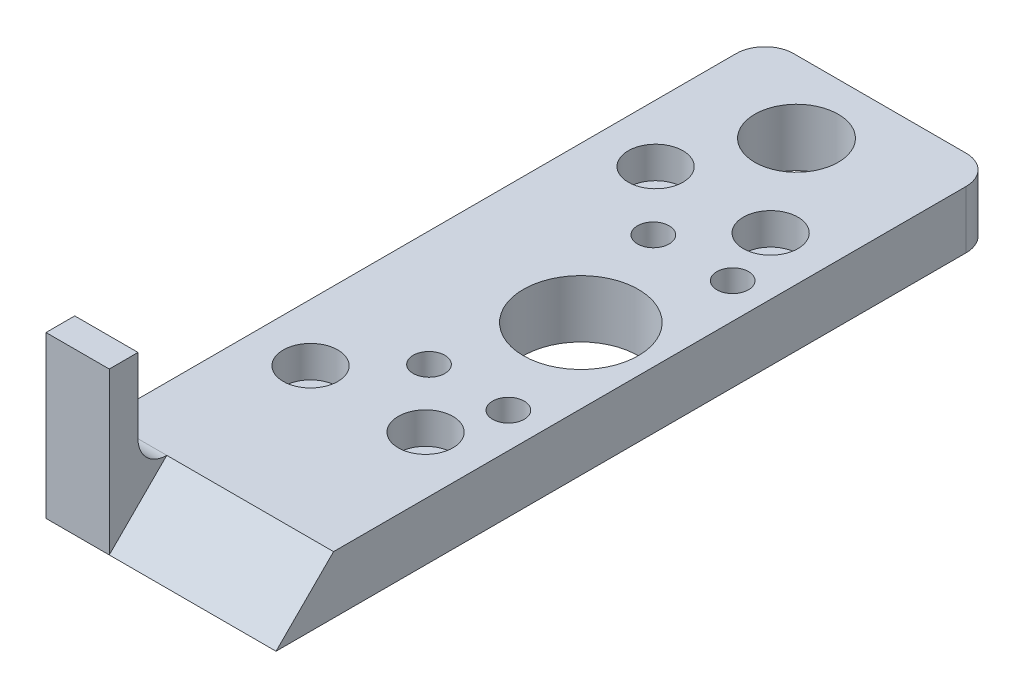
ISO-10303-21;
HEADER;
FILE_DESCRIPTION(('STEP AP214'),'2;1');
FILE_NAME('part.step','',(''),(''),'','','');
FILE_SCHEMA(('AUTOMOTIVE_DESIGN { 1 0 10303 214 1 1 1 1 }'));
ENDSEC;
DATA;
#1=APPLICATION_CONTEXT('core data for automotive mechanical design processes');
#2=APPLICATION_PROTOCOL_DEFINITION('international standard','automotive_design',2000,#1);
#3=PRODUCT_CONTEXT('',#1,'mechanical');
#4=PRODUCT('Part','Part','',(#3));
#5=PRODUCT_RELATED_PRODUCT_CATEGORY('part','',(#4));
#6=PRODUCT_DEFINITION_FORMATION('','',#4);
#7=PRODUCT_DEFINITION_CONTEXT('part definition',#1,'design');
#8=PRODUCT_DEFINITION('design','',#6,#7);
#9=PRODUCT_DEFINITION_SHAPE('','',#8);
#10=(LENGTH_UNIT() NAMED_UNIT(*) SI_UNIT(.MILLI.,.METRE.));
#11=(NAMED_UNIT(*) PLANE_ANGLE_UNIT() SI_UNIT($,.RADIAN.));
#12=(NAMED_UNIT(*) SI_UNIT($,.STERADIAN.) SOLID_ANGLE_UNIT());
#13=UNCERTAINTY_MEASURE_WITH_UNIT(LENGTH_MEASURE(1.E-05),#10,'distance_accuracy_value','');
#14=(GEOMETRIC_REPRESENTATION_CONTEXT(3) GLOBAL_UNCERTAINTY_ASSIGNED_CONTEXT((#13)) GLOBAL_UNIT_ASSIGNED_CONTEXT((#10,
#11,#12)) REPRESENTATION_CONTEXT('',''));
#15=CARTESIAN_POINT('',(0.,0.,0.));
#16=DIRECTION('',(0.,0.,1.));
#17=DIRECTION('',(1.,0.,0.));
#18=AXIS2_PLACEMENT_3D('',#15,#16,#17);
#19=CARTESIAN_POINT('',(20.,28.,-5.));
#20=DIRECTION('',(0.,-1.,0.));
#21=DIRECTION('',(0.,0.,-1.));
#22=AXIS2_PLACEMENT_3D('',#19,#20,#21);
#23=PLANE('',#22);
#24=DIRECTION('',(-1.,0.,0.));
#25=VECTOR('',#24,1.);
#26=CARTESIAN_POINT('',(20.,28.,0.));
#27=LINE('',#26,#25);
#28=CARTESIAN_POINT('',(-9.,28.,0.));
#29=VERTEX_POINT('',#28);
#30=CARTESIAN_POINT('',(-20.,28.,0.));
#31=VERTEX_POINT('',#30);
#32=EDGE_CURVE('E128',#29,#31,#27,.T.);
#33=ORIENTED_EDGE('',*,*,#32,.F.);
#34=DIRECTION('',(0.,0.,1.));
#35=VECTOR('',#34,1.);
#36=CARTESIAN_POINT('',(-9.,28.,-5.));
#37=LINE('',#36,#35);
#38=CARTESIAN_POINT('',(-9.,28.,-5.));
#39=VERTEX_POINT('',#38);
#40=EDGE_CURVE('E112',#39,#29,#37,.T.);
#41=ORIENTED_EDGE('',*,*,#40,.F.);
#42=DIRECTION('',(-1.,0.,0.));
#43=VECTOR('',#42,1.);
#44=CARTESIAN_POINT('',(20.,28.,-5.));
#45=LINE('',#44,#43);
#46=CARTESIAN_POINT('',(-20.,28.,-5.));
#47=VERTEX_POINT('',#46);
#48=EDGE_CURVE('E237',#39,#47,#45,.T.);
#49=ORIENTED_EDGE('',*,*,#48,.T.);
#50=DIRECTION('',(0.,0.,1.));
#51=VECTOR('',#50,1.);
#52=CARTESIAN_POINT('',(-20.,28.,-5.));
#53=LINE('',#52,#51);
#54=EDGE_CURVE('E132',#47,#31,#53,.T.);
#55=ORIENTED_EDGE('',*,*,#54,.T.);
#56=EDGE_LOOP('',(#33,#41,#49,#55));
#57=FACE_BOUND('',#56,.T.);
#58=ADVANCED_FACE('F32',(#57),#23,.F.);
#59=CARTESIAN_POINT('',(20.,28.,0.));
#60=DIRECTION('',(0.,0.,-1.));
#61=DIRECTION('',(0.,1.,0.));
#62=AXIS2_PLACEMENT_3D('',#59,#60,#61);
#63=PLANE('',#62);
#64=DIRECTION('',(-1.,0.,0.));
#65=VECTOR('',#64,1.);
#66=CARTESIAN_POINT('',(20.,0.,0.));
#67=LINE('',#66,#65);
#68=CARTESIAN_POINT('',(-9.,0.,0.));
#69=VERTEX_POINT('',#68);
#70=CARTESIAN_POINT('',(-20.,0.,0.));
#71=VERTEX_POINT('',#70);
#72=EDGE_CURVE('E130',#69,#71,#67,.T.);
#73=ORIENTED_EDGE('',*,*,#72,.F.);
#74=DIRECTION('',(0.,1.,0.));
#75=VECTOR('',#74,1.);
#76=CARTESIAN_POINT('',(-9.,-19.4278779391243,0.));
#77=LINE('',#76,#75);
#78=EDGE_CURVE('E115',#69,#29,#77,.T.);
#79=ORIENTED_EDGE('',*,*,#78,.T.);
#80=ORIENTED_EDGE('',*,*,#32,.T.);
#81=DIRECTION('',(0.,-1.,0.));
#82=VECTOR('',#81,1.);
#83=CARTESIAN_POINT('',(-20.,28.,0.));
#84=LINE('',#83,#82);
#85=EDGE_CURVE('E233',#31,#71,#84,.T.);
#86=ORIENTED_EDGE('',*,*,#85,.T.);
#87=EDGE_LOOP('',(#73,#79,#80,#86));
#88=FACE_BOUND('',#87,.T.);
#89=ADVANCED_FACE('F126',(#88),#63,.F.);
#90=CARTESIAN_POINT('',(20.,0.,0.));
#91=DIRECTION('',(0.,1.,0.));
#92=DIRECTION('',(0.,0.,1.));
#93=AXIS2_PLACEMENT_3D('',#90,#91,#92);
#94=PLANE('',#93);
#95=CARTESIAN_POINT('',(-2.,0.,-112.5));
#96=DIRECTION('',(0.,1.,0.));
#97=DIRECTION('',(0.,0.,1.));
#98=AXIS2_PLACEMENT_3D('',#95,#96,#97);
#99=CIRCLE('',#98,7.25);
#100=CARTESIAN_POINT('',(-2.,0.,-105.25));
#101=VERTEX_POINT('',#100);
#102=EDGE_CURVE('E313',#101,#101,#99,.T.);
#103=ORIENTED_EDGE('',*,*,#102,.T.);
#104=EDGE_LOOP('',(#103));
#105=FACE_BOUND('',#104,.T.);
#106=CARTESIAN_POINT('',(10.,0.,-96.));
#107=DIRECTION('',(0.,1.,0.));
#108=DIRECTION('',(0.,0.,1.));
#109=AXIS2_PLACEMENT_3D('',#106,#107,#108);
#110=CIRCLE('',#109,2.75000000000001);
#111=CARTESIAN_POINT('',(10.,0.,-93.25));
#112=VERTEX_POINT('',#111);
#113=EDGE_CURVE('E195',#112,#112,#110,.T.);
#114=ORIENTED_EDGE('',*,*,#113,.T.);
#115=EDGE_LOOP('',(#114));
#116=FACE_BOUND('',#115,.T.);
#117=CARTESIAN_POINT('',(-10.,0.,-96.));
#118=DIRECTION('',(0.,1.,0.));
#119=DIRECTION('',(0.,0.,1.));
#120=AXIS2_PLACEMENT_3D('',#117,#118,#119);
#121=CIRCLE('',#120,2.75000000000001);
#122=CARTESIAN_POINT('',(-10.,0.,-93.25));
#123=VERTEX_POINT('',#122);
#124=EDGE_CURVE('E190',#123,#123,#121,.T.);
#125=ORIENTED_EDGE('',*,*,#124,.T.);
#126=EDGE_LOOP('',(#125));
#127=FACE_BOUND('',#126,.T.);
#128=CARTESIAN_POINT('',(-10.,0.,-36.));
#129=DIRECTION('',(0.,1.,0.));
#130=DIRECTION('',(0.,0.,1.));
#131=AXIS2_PLACEMENT_3D('',#128,#129,#130);
#132=CIRCLE('',#131,2.75000000000001);
#133=CARTESIAN_POINT('',(-10.,0.,-33.25));
#134=VERTEX_POINT('',#133);
#135=EDGE_CURVE('E185',#134,#134,#132,.T.);
#136=ORIENTED_EDGE('',*,*,#135,.T.);
#137=EDGE_LOOP('',(#136));
#138=FACE_BOUND('',#137,.T.);
#139=CARTESIAN_POINT('',(10.,0.,-36.));
#140=DIRECTION('',(0.,1.,0.));
#141=DIRECTION('',(0.,0.,1.));
#142=AXIS2_PLACEMENT_3D('',#139,#140,#141);
#143=CIRCLE('',#142,2.75000000000001);
#144=CARTESIAN_POINT('',(10.,0.,-33.25));
#145=VERTEX_POINT('',#144);
#146=EDGE_CURVE('E180',#145,#145,#143,.T.);
#147=ORIENTED_EDGE('',*,*,#146,.T.);
#148=EDGE_LOOP('',(#147));
#149=FACE_BOUND('',#148,.T.);
#150=CARTESIAN_POINT('',(13.9,0.,-46.5));
#151=DIRECTION('',(0.,-1.,0.));
#152=DIRECTION('',(0.,0.,-1.));
#153=AXIS2_PLACEMENT_3D('',#150,#151,#152);
#154=CIRCLE('',#153,4.75000000000001);
#155=CARTESIAN_POINT('',(13.9,0.,-51.25));
#156=VERTEX_POINT('',#155);
#157=EDGE_CURVE('E183',#156,#156,#154,.T.);
#158=ORIENTED_EDGE('',*,*,#157,.F.);
#159=EDGE_LOOP('',(#158));
#160=FACE_BOUND('',#159,.T.);
#161=CARTESIAN_POINT('',(0.0999999999999987,0.,-46.5));
#162=DIRECTION('',(0.,-1.,0.));
#163=DIRECTION('',(0.,0.,-1.));
#164=AXIS2_PLACEMENT_3D('',#161,#162,#163);
#165=CIRCLE('',#164,4.75000000000001);
#166=CARTESIAN_POINT('',(0.0999999999999987,0.,-51.25));
#167=VERTEX_POINT('',#166);
#168=EDGE_CURVE('E178',#167,#167,#165,.T.);
#169=ORIENTED_EDGE('',*,*,#168,.F.);
#170=EDGE_LOOP('',(#169));
#171=FACE_BOUND('',#170,.T.);
#172=CARTESIAN_POINT('',(0.100000000000001,0.,-85.5));
#173=DIRECTION('',(0.,-1.,0.));
#174=DIRECTION('',(0.,0.,-1.));
#175=AXIS2_PLACEMENT_3D('',#172,#173,#174);
#176=CIRCLE('',#175,4.75000000000001);
#177=CARTESIAN_POINT('',(0.100000000000001,0.,-90.25));
#178=VERTEX_POINT('',#177);
#179=EDGE_CURVE('E173',#178,#178,#176,.T.);
#180=ORIENTED_EDGE('',*,*,#179,.F.);
#181=EDGE_LOOP('',(#180));
#182=FACE_BOUND('',#181,.T.);
#183=CARTESIAN_POINT('',(13.9,0.,-85.5));
#184=DIRECTION('',(0.,-1.,0.));
#185=DIRECTION('',(0.,0.,-1.));
#186=AXIS2_PLACEMENT_3D('',#183,#184,#185);
#187=CIRCLE('',#186,4.75000000000001);
#188=CARTESIAN_POINT('',(13.9,0.,-90.25));
#189=VERTEX_POINT('',#188);
#190=EDGE_CURVE('E168',#189,#189,#187,.T.);
#191=ORIENTED_EDGE('',*,*,#190,.F.);
#192=EDGE_LOOP('',(#191));
#193=FACE_BOUND('',#192,.T.);
#194=CARTESIAN_POINT('',(7.,0.,-66.));
#195=DIRECTION('',(0.,1.,0.));
#196=DIRECTION('',(0.,0.,1.));
#197=AXIS2_PLACEMENT_3D('',#194,#195,#196);
#198=CIRCLE('',#197,10.);
#199=CARTESIAN_POINT('',(7.,0.,-56.));
#200=VERTEX_POINT('',#199);
#201=EDGE_CURVE('E123',#200,#200,#198,.T.);
#202=ORIENTED_EDGE('',*,*,#201,.T.);
#203=EDGE_LOOP('',(#202));
#204=FACE_BOUND('',#203,.T.);
#205=DIRECTION('',(0.,0.,-1.));
#206=VECTOR('',#205,1.);
#207=CARTESIAN_POINT('',(-20.,0.,0.));
#208=LINE('',#207,#206);
#209=CARTESIAN_POINT('',(-20.,0.,-120.));
#210=VERTEX_POINT('',#209);
#211=EDGE_CURVE('E213',#71,#210,#208,.T.);
#212=ORIENTED_EDGE('',*,*,#211,.T.);
#213=CARTESIAN_POINT('',(-15.,0.,-120.));
#214=DIRECTION('',(0.,1.,0.));
#215=DIRECTION('',(0.,0.,1.));
#216=AXIS2_PLACEMENT_3D('',#213,#214,#215);
#217=CIRCLE('',#216,5.);
#218=CARTESIAN_POINT('',(-15.,0.,-125.));
#219=VERTEX_POINT('',#218);
#220=EDGE_CURVE('E40',#210,#219,#217,.F.);
#221=ORIENTED_EDGE('',*,*,#220,.T.);
#222=DIRECTION('',(-1.,0.,0.));
#223=VECTOR('',#222,1.);
#224=CARTESIAN_POINT('',(20.,0.,-125.));
#225=LINE('',#224,#223);
#226=CARTESIAN_POINT('',(15.,0.,-125.));
#227=VERTEX_POINT('',#226);
#228=EDGE_CURVE('E212',#227,#219,#225,.T.);
#229=ORIENTED_EDGE('',*,*,#228,.F.);
#230=CARTESIAN_POINT('',(15.,0.,-120.));
#231=DIRECTION('',(0.,1.,0.));
#232=DIRECTION('',(0.,0.,1.));
#233=AXIS2_PLACEMENT_3D('',#230,#231,#232);
#234=CIRCLE('',#233,5.);
#235=CARTESIAN_POINT('',(20.,0.,-120.));
#236=VERTEX_POINT('',#235);
#237=EDGE_CURVE('E47',#227,#236,#234,.F.);
#238=ORIENTED_EDGE('',*,*,#237,.T.);
#239=DIRECTION('',(0.,0.,-1.));
#240=VECTOR('',#239,1.);
#241=CARTESIAN_POINT('',(20.,0.,0.));
#242=LINE('',#241,#240);
#243=CARTESIAN_POINT('',(20.,0.,0.));
#244=VERTEX_POINT('',#243);
#245=EDGE_CURVE('E231',#244,#236,#242,.T.);
#246=ORIENTED_EDGE('',*,*,#245,.F.);
#247=EDGE_CURVE('E137',#244,#69,#67,.T.);
#248=ORIENTED_EDGE('',*,*,#247,.T.);
#249=ORIENTED_EDGE('',*,*,#72,.T.);
#250=EDGE_LOOP('',(#212,#221,#229,#238,#246,#248,#249));
#251=FACE_BOUND('',#250,.T.);
#252=ADVANCED_FACE('F211',(#105,#116,#127,#138,#149,#160,#171,#182,#193,#204,#251),#94,.F.);
#253=CARTESIAN_POINT('',(20.,0.,-125.));
#254=DIRECTION('',(0.,0.,1.));
#255=DIRECTION('',(1.,0.,0.));
#256=AXIS2_PLACEMENT_3D('',#253,#254,#255);
#257=PLANE('',#256);
#258=ORIENTED_EDGE('',*,*,#228,.T.);
#259=DIRECTION('',(0.,1.,0.));
#260=VECTOR('',#259,1.);
#261=CARTESIAN_POINT('',(-15.,0.,-125.));
#262=LINE('',#261,#260);
#263=CARTESIAN_POINT('',(-15.,10.,-125.));
#264=VERTEX_POINT('',#263);
#265=EDGE_CURVE('E201',#219,#264,#262,.T.);
#266=ORIENTED_EDGE('',*,*,#265,.T.);
#267=DIRECTION('',(-1.,0.,0.));
#268=VECTOR('',#267,1.);
#269=CARTESIAN_POINT('',(20.,10.,-125.));
#270=LINE('',#269,#268);
#271=CARTESIAN_POINT('',(15.,10.,-125.));
#272=VERTEX_POINT('',#271);
#273=EDGE_CURVE('E221',#272,#264,#270,.T.);
#274=ORIENTED_EDGE('',*,*,#273,.F.);
#275=DIRECTION('',(0.,1.,0.));
#276=VECTOR('',#275,1.);
#277=CARTESIAN_POINT('',(15.,0.,-125.));
#278=LINE('',#277,#276);
#279=EDGE_CURVE('E159',#272,#227,#278,.F.);
#280=ORIENTED_EDGE('',*,*,#279,.T.);
#281=EDGE_LOOP('',(#258,#266,#274,#280));
#282=FACE_BOUND('',#281,.T.);
#283=ADVANCED_FACE('F217',(#282),#257,.F.);
#284=CARTESIAN_POINT('',(20.,10.,-125.));
#285=DIRECTION('',(0.,-1.,0.));
#286=DIRECTION('',(0.,0.,-1.));
#287=AXIS2_PLACEMENT_3D('',#284,#285,#286);
#288=PLANE('',#287);
#289=CARTESIAN_POINT('',(-2.,10.,-112.5));
#290=DIRECTION('',(0.,1.,0.));
#291=DIRECTION('',(0.,0.,1.));
#292=AXIS2_PLACEMENT_3D('',#289,#290,#291);
#293=CIRCLE('',#292,7.25);
#294=CARTESIAN_POINT('',(-2.,10.,-105.25));
#295=VERTEX_POINT('',#294);
#296=EDGE_CURVE('E392',#295,#295,#293,.T.);
#297=ORIENTED_EDGE('',*,*,#296,.F.);
#298=EDGE_LOOP('',(#297));
#299=FACE_BOUND('',#298,.T.);
#300=CARTESIAN_POINT('',(10.,10.,-96.));
#301=DIRECTION('',(0.,1.,0.));
#302=DIRECTION('',(0.,0.,1.));
#303=AXIS2_PLACEMENT_3D('',#300,#301,#302);
#304=CIRCLE('',#303,4.75000000000001);
#305=CARTESIAN_POINT('',(10.,10.,-91.25));
#306=VERTEX_POINT('',#305);
#307=EDGE_CURVE('E389',#306,#306,#304,.T.);
#308=ORIENTED_EDGE('',*,*,#307,.F.);
#309=EDGE_LOOP('',(#308));
#310=FACE_BOUND('',#309,.T.);
#311=CARTESIAN_POINT('',(-10.,10.,-96.));
#312=DIRECTION('',(0.,1.,0.));
#313=DIRECTION('',(0.,0.,1.));
#314=AXIS2_PLACEMENT_3D('',#311,#312,#313);
#315=CIRCLE('',#314,4.75000000000001);
#316=CARTESIAN_POINT('',(-10.,10.,-91.25));
#317=VERTEX_POINT('',#316);
#318=EDGE_CURVE('E198',#317,#317,#315,.T.);
#319=ORIENTED_EDGE('',*,*,#318,.F.);
#320=EDGE_LOOP('',(#319));
#321=FACE_BOUND('',#320,.T.);
#322=CARTESIAN_POINT('',(-10.,9.99999999999999,-36.));
#323=DIRECTION('',(0.,1.,0.));
#324=DIRECTION('',(0.,0.,1.));
#325=AXIS2_PLACEMENT_3D('',#322,#323,#324);
#326=CIRCLE('',#325,4.75000000000001);
#327=CARTESIAN_POINT('',(-10.,9.99999999999999,-31.25));
#328=VERTEX_POINT('',#327);
#329=EDGE_CURVE('E193',#328,#328,#326,.T.);
#330=ORIENTED_EDGE('',*,*,#329,.F.);
#331=EDGE_LOOP('',(#330));
#332=FACE_BOUND('',#331,.T.);
#333=CARTESIAN_POINT('',(10.,9.99999999999999,-36.));
#334=DIRECTION('',(0.,1.,0.));
#335=DIRECTION('',(0.,0.,1.));
#336=AXIS2_PLACEMENT_3D('',#333,#334,#335);
#337=CIRCLE('',#336,4.75000000000001);
#338=CARTESIAN_POINT('',(10.,9.99999999999999,-31.25));
#339=VERTEX_POINT('',#338);
#340=EDGE_CURVE('E188',#339,#339,#337,.T.);
#341=ORIENTED_EDGE('',*,*,#340,.F.);
#342=EDGE_LOOP('',(#341));
#343=FACE_BOUND('',#342,.T.);
#344=CARTESIAN_POINT('',(13.9,9.99999999999999,-46.5));
#345=DIRECTION('',(0.,-1.,0.));
#346=DIRECTION('',(0.,0.,-1.));
#347=AXIS2_PLACEMENT_3D('',#344,#345,#346);
#348=CIRCLE('',#347,2.75000000000001);
#349=CARTESIAN_POINT('',(13.9,9.99999999999999,-49.25));
#350=VERTEX_POINT('',#349);
#351=EDGE_CURVE('E175',#350,#350,#348,.T.);
#352=ORIENTED_EDGE('',*,*,#351,.T.);
#353=EDGE_LOOP('',(#352));
#354=FACE_BOUND('',#353,.T.);
#355=CARTESIAN_POINT('',(0.0999999999999987,9.99999999999999,-46.5));
#356=DIRECTION('',(0.,-1.,0.));
#357=DIRECTION('',(0.,0.,-1.));
#358=AXIS2_PLACEMENT_3D('',#355,#356,#357);
#359=CIRCLE('',#358,2.75000000000001);
#360=CARTESIAN_POINT('',(0.0999999999999987,9.99999999999999,-49.25));
#361=VERTEX_POINT('',#360);
#362=EDGE_CURVE('E170',#361,#361,#359,.T.);
#363=ORIENTED_EDGE('',*,*,#362,.T.);
#364=EDGE_LOOP('',(#363));
#365=FACE_BOUND('',#364,.T.);
#366=CARTESIAN_POINT('',(0.100000000000001,9.99999999999999,-85.5));
#367=DIRECTION('',(0.,-1.,0.));
#368=DIRECTION('',(0.,0.,-1.));
#369=AXIS2_PLACEMENT_3D('',#366,#367,#368);
#370=CIRCLE('',#369,2.75000000000001);
#371=CARTESIAN_POINT('',(0.100000000000001,9.99999999999999,-88.25));
#372=VERTEX_POINT('',#371);
#373=EDGE_CURVE('E165',#372,#372,#370,.T.);
#374=ORIENTED_EDGE('',*,*,#373,.T.);
#375=EDGE_LOOP('',(#374));
#376=FACE_BOUND('',#375,.T.);
#377=CARTESIAN_POINT('',(13.9,9.99999999999999,-85.5));
#378=DIRECTION('',(0.,-1.,0.));
#379=DIRECTION('',(0.,0.,-1.));
#380=AXIS2_PLACEMENT_3D('',#377,#378,#379);
#381=CIRCLE('',#380,2.75000000000001);
#382=CARTESIAN_POINT('',(13.9,9.99999999999999,-88.25));
#383=VERTEX_POINT('',#382);
#384=EDGE_CURVE('E160',#383,#383,#381,.T.);
#385=ORIENTED_EDGE('',*,*,#384,.T.);
#386=EDGE_LOOP('',(#385));
#387=FACE_BOUND('',#386,.T.);
#388=CARTESIAN_POINT('',(7.,9.99999999999999,-66.));
#389=DIRECTION('',(0.,1.,0.));
#390=DIRECTION('',(0.,0.,1.));
#391=AXIS2_PLACEMENT_3D('',#388,#389,#390);
#392=CIRCLE('',#391,10.);
#393=CARTESIAN_POINT('',(7.,9.99999999999999,-56.));
#394=VERTEX_POINT('',#393);
#395=EDGE_CURVE('E163',#394,#394,#392,.T.);
#396=ORIENTED_EDGE('',*,*,#395,.F.);
#397=EDGE_LOOP('',(#396));
#398=FACE_BOUND('',#397,.T.);
#399=ORIENTED_EDGE('',*,*,#273,.T.);
#400=CARTESIAN_POINT('',(-15.,10.,-120.));
#401=DIRECTION('',(0.,-1.,0.));
#402=DIRECTION('',(0.,0.,-1.));
#403=AXIS2_PLACEMENT_3D('',#400,#401,#402);
#404=CIRCLE('',#403,5.);
#405=CARTESIAN_POINT('',(-20.,10.,-120.));
#406=VERTEX_POINT('',#405);
#407=EDGE_CURVE('E206',#264,#406,#404,.F.);
#408=ORIENTED_EDGE('',*,*,#407,.T.);
#409=DIRECTION('',(0.,0.,1.));
#410=VECTOR('',#409,1.);
#411=CARTESIAN_POINT('',(-20.,10.,-125.));
#412=LINE('',#411,#410);
#413=CARTESIAN_POINT('',(-20.,9.99999999999999,-10.));
#414=VERTEX_POINT('',#413);
#415=EDGE_CURVE('E225',#406,#414,#412,.T.);
#416=ORIENTED_EDGE('',*,*,#415,.T.);
#417=DIRECTION('',(-1.,0.,0.));
#418=VECTOR('',#417,1.);
#419=CARTESIAN_POINT('',(-9.,9.99999999999999,-10.));
#420=LINE('',#419,#418);
#421=CARTESIAN_POINT('',(-9.,9.99999999999998,-10.));
#422=VERTEX_POINT('',#421);
#423=EDGE_CURVE('E140',#414,#422,#420,.F.);
#424=ORIENTED_EDGE('',*,*,#423,.T.);
#425=DIRECTION('',(1.,0.,0.));
#426=VECTOR('',#425,1.);
#427=CARTESIAN_POINT('',(20.,9.99999999999999,-10.));
#428=LINE('',#427,#426);
#429=CARTESIAN_POINT('',(20.,9.99999999999998,-10.));
#430=VERTEX_POINT('',#429);
#431=EDGE_CURVE('E152',#422,#430,#428,.T.);
#432=ORIENTED_EDGE('',*,*,#431,.T.);
#433=DIRECTION('',(0.,0.,1.));
#434=VECTOR('',#433,1.);
#435=CARTESIAN_POINT('',(20.,10.,-125.));
#436=LINE('',#435,#434);
#437=CARTESIAN_POINT('',(20.,10.,-120.));
#438=VERTEX_POINT('',#437);
#439=EDGE_CURVE('E239',#438,#430,#436,.T.);
#440=ORIENTED_EDGE('',*,*,#439,.F.);
#441=CARTESIAN_POINT('',(15.,10.,-120.));
#442=DIRECTION('',(0.,-1.,0.));
#443=DIRECTION('',(0.,0.,-1.));
#444=AXIS2_PLACEMENT_3D('',#441,#442,#443);
#445=CIRCLE('',#444,5.);
#446=EDGE_CURVE('E204',#438,#272,#445,.F.);
#447=ORIENTED_EDGE('',*,*,#446,.T.);
#448=EDGE_LOOP('',(#399,#408,#416,#424,#432,#440,#447));
#449=FACE_BOUND('',#448,.T.);
#450=ADVANCED_FACE('F224',(#299,#310,#321,#332,#343,#354,#365,#376,#387,#398,#449),#288,.F.);
#451=CARTESIAN_POINT('',(20.,9.99999999999999,-5.));
#452=DIRECTION('',(0.,0.,1.));
#453=DIRECTION('',(0.,-1.,0.));
#454=AXIS2_PLACEMENT_3D('',#451,#452,#453);
#455=PLANE('',#454);
#456=DIRECTION('',(0.,1.,0.));
#457=VECTOR('',#456,1.);
#458=CARTESIAN_POINT('',(-9.,-19.4278779391243,-5.));
#459=LINE('',#458,#457);
#460=CARTESIAN_POINT('',(-9.,15.,-5.));
#461=VERTEX_POINT('',#460);
#462=EDGE_CURVE('E118',#461,#39,#459,.T.);
#463=ORIENTED_EDGE('',*,*,#462,.F.);
#464=DIRECTION('',(-1.,0.,0.));
#465=VECTOR('',#464,1.);
#466=CARTESIAN_POINT('',(-20.,15.,-5.));
#467=LINE('',#466,#465);
#468=CARTESIAN_POINT('',(-20.,15.,-5.));
#469=VERTEX_POINT('',#468);
#470=EDGE_CURVE('E136',#461,#469,#467,.T.);
#471=ORIENTED_EDGE('',*,*,#470,.T.);
#472=DIRECTION('',(0.,1.,0.));
#473=VECTOR('',#472,1.);
#474=CARTESIAN_POINT('',(-20.,9.99999999999999,-5.));
#475=LINE('',#474,#473);
#476=EDGE_CURVE('E229',#469,#47,#475,.T.);
#477=ORIENTED_EDGE('',*,*,#476,.T.);
#478=ORIENTED_EDGE('',*,*,#48,.F.);
#479=EDGE_LOOP('',(#463,#471,#477,#478));
#480=FACE_BOUND('',#479,.T.);
#481=ADVANCED_FACE('F248',(#480),#455,.F.);
#482=CARTESIAN_POINT('',(20.,28.,0.));
#483=DIRECTION('',(1.,0.,0.));
#484=DIRECTION('',(0.,0.,-1.));
#485=AXIS2_PLACEMENT_3D('',#482,#483,#484);
#486=PLANE('',#485);
#487=ORIENTED_EDGE('',*,*,#245,.T.);
#488=DIRECTION('',(0.,1.,0.));
#489=VECTOR('',#488,1.);
#490=CARTESIAN_POINT('',(20.,10.,-120.));
#491=LINE('',#490,#489);
#492=EDGE_CURVE('E11',#236,#438,#491,.T.);
#493=ORIENTED_EDGE('',*,*,#492,.T.);
#494=ORIENTED_EDGE('',*,*,#439,.T.);
#495=DIRECTION('',(0.,0.707106781186549,-0.707106781186546));
#496=VECTOR('',#495,1.);
#497=CARTESIAN_POINT('',(20.,14.,-14.));
#498=LINE('',#497,#496);
#499=EDGE_CURVE('E155',#430,#244,#498,.F.);
#500=ORIENTED_EDGE('',*,*,#499,.T.);
#501=EDGE_LOOP('',(#487,#493,#494,#500));
#502=FACE_BOUND('',#501,.T.);
#503=ADVANCED_FACE('F258',(#502),#486,.T.);
#504=CARTESIAN_POINT('',(-20.,28.,0.));
#505=DIRECTION('',(1.,0.,0.));
#506=DIRECTION('',(0.,0.,-1.));
#507=AXIS2_PLACEMENT_3D('',#504,#505,#506);
#508=PLANE('',#507);
#509=ORIENTED_EDGE('',*,*,#415,.F.);
#510=DIRECTION('',(0.,1.,0.));
#511=VECTOR('',#510,1.);
#512=CARTESIAN_POINT('',(-20.,28.,-120.));
#513=LINE('',#512,#511);
#514=EDGE_CURVE('E55',#406,#210,#513,.F.);
#515=ORIENTED_EDGE('',*,*,#514,.T.);
#516=ORIENTED_EDGE('',*,*,#211,.F.);
#517=ORIENTED_EDGE('',*,*,#85,.F.);
#518=ORIENTED_EDGE('',*,*,#54,.F.);
#519=ORIENTED_EDGE('',*,*,#476,.F.);
#520=CARTESIAN_POINT('',(-20.,15.,-10.));
#521=DIRECTION('',(1.,0.,0.));
#522=DIRECTION('',(0.,0.,-1.));
#523=AXIS2_PLACEMENT_3D('',#520,#521,#522);
#524=CIRCLE('',#523,5.);
#525=EDGE_CURVE('E147',#469,#414,#524,.T.);
#526=ORIENTED_EDGE('',*,*,#525,.T.);
#527=EDGE_LOOP('',(#509,#515,#516,#517,#518,#519,#526));
#528=FACE_BOUND('',#527,.T.);
#529=ADVANCED_FACE('F226',(#528),#508,.F.);
#530=CARTESIAN_POINT('',(-9.,-19.4278779391243,-5.));
#531=DIRECTION('',(-1.,0.,0.));
#532=DIRECTION('',(0.,0.,1.));
#533=AXIS2_PLACEMENT_3D('',#530,#531,#532);
#534=PLANE('',#533);
#535=ORIENTED_EDGE('',*,*,#78,.F.);
#536=DIRECTION('',(0.,-0.707106781186549,0.707106781186546));
#537=VECTOR('',#536,1.);
#538=CARTESIAN_POINT('',(-9.,-7.21393896956223,7.21393896956215));
#539=LINE('',#538,#537);
#540=EDGE_CURVE('E157',#69,#422,#539,.F.);
#541=ORIENTED_EDGE('',*,*,#540,.T.);
#542=CARTESIAN_POINT('',(-9.,15.,-10.));
#543=DIRECTION('',(-1.,0.,0.));
#544=DIRECTION('',(0.,0.,1.));
#545=AXIS2_PLACEMENT_3D('',#542,#543,#544);
#546=CIRCLE('',#545,5.);
#547=EDGE_CURVE('E150',#422,#461,#546,.T.);
#548=ORIENTED_EDGE('',*,*,#547,.T.);
#549=ORIENTED_EDGE('',*,*,#462,.T.);
#550=ORIENTED_EDGE('',*,*,#40,.T.);
#551=EDGE_LOOP('',(#535,#541,#548,#549,#550));
#552=FACE_BOUND('',#551,.T.);
#553=ADVANCED_FACE('F114',(#552),#534,.F.);
#554=CARTESIAN_POINT('',(20.,15.,-10.));
#555=DIRECTION('',(1.,0.,0.));
#556=DIRECTION('',(0.,0.,-1.));
#557=AXIS2_PLACEMENT_3D('',#554,#555,#556);
#558=CYLINDRICAL_SURFACE('',#557,5.);
#559=ORIENTED_EDGE('',*,*,#547,.F.);
#560=ORIENTED_EDGE('',*,*,#423,.F.);
#561=ORIENTED_EDGE('',*,*,#525,.F.);
#562=ORIENTED_EDGE('',*,*,#470,.F.);
#563=EDGE_LOOP('',(#559,#560,#561,#562));
#564=FACE_BOUND('',#563,.T.);
#565=ADVANCED_FACE('F252',(#564),#558,.F.);
#566=CARTESIAN_POINT('',(20.,9.99999999999999,-10.));
#567=DIRECTION('',(0.,-0.707106781186546,-0.707106781186549));
#568=DIRECTION('',(0.,0.707106781186549,-0.707106781186546));
#569=AXIS2_PLACEMENT_3D('',#566,#567,#568);
#570=PLANE('',#569);
#571=ORIENTED_EDGE('',*,*,#540,.F.);
#572=ORIENTED_EDGE('',*,*,#247,.F.);
#573=ORIENTED_EDGE('',*,*,#499,.F.);
#574=ORIENTED_EDGE('',*,*,#431,.F.);
#575=EDGE_LOOP('',(#571,#572,#573,#574));
#576=FACE_BOUND('',#575,.T.);
#577=ADVANCED_FACE('F256',(#576),#570,.F.);
#578=CARTESIAN_POINT('',(7.,0.,-66.));
#579=DIRECTION('',(0.,1.,0.));
#580=DIRECTION('',(0.,0.,1.));
#581=AXIS2_PLACEMENT_3D('',#578,#579,#580);
#582=CYLINDRICAL_SURFACE('',#581,10.);
#583=ORIENTED_EDGE('',*,*,#201,.F.);
#584=EDGE_LOOP('',(#583));
#585=FACE_BOUND('',#584,.T.);
#586=ORIENTED_EDGE('',*,*,#395,.T.);
#587=EDGE_LOOP('',(#586));
#588=FACE_BOUND('',#587,.T.);
#589=ADVANCED_FACE('F277',(#585,#588),#582,.F.);
#590=CARTESIAN_POINT('',(13.9,0.,-85.5));
#591=DIRECTION('',(0.,-1.,0.));
#592=DIRECTION('',(0.,0.,-1.));
#593=AXIS2_PLACEMENT_3D('',#590,#591,#592);
#594=CYLINDRICAL_SURFACE('',#593,2.75000000000001);
#595=CARTESIAN_POINT('',(13.9,5.5,-85.5));
#596=DIRECTION('',(0.,-1.,0.));
#597=DIRECTION('',(0.,0.,-1.));
#598=AXIS2_PLACEMENT_3D('',#595,#596,#597);
#599=CIRCLE('',#598,2.75000000000001);
#600=CARTESIAN_POINT('',(13.9,5.5,-88.25));
#601=VERTEX_POINT('',#600);
#602=EDGE_CURVE('E164',#601,#601,#599,.T.);
#603=ORIENTED_EDGE('',*,*,#602,.T.);
#604=EDGE_LOOP('',(#603));
#605=FACE_BOUND('',#604,.T.);
#606=ORIENTED_EDGE('',*,*,#384,.F.);
#607=EDGE_LOOP('',(#606));
#608=FACE_BOUND('',#607,.T.);
#609=ADVANCED_FACE('F281',(#605,#608),#594,.F.);
#610=CARTESIAN_POINT('',(16.65,5.5,-85.5));
#611=DIRECTION('',(0.,1.,0.));
#612=DIRECTION('',(0.,0.,1.));
#613=AXIS2_PLACEMENT_3D('',#610,#611,#612);
#614=PLANE('',#613);
#615=ORIENTED_EDGE('',*,*,#602,.F.);
#616=EDGE_LOOP('',(#615));
#617=FACE_BOUND('',#616,.T.);
#618=CARTESIAN_POINT('',(13.9,5.5,-85.5));
#619=DIRECTION('',(0.,-1.,0.));
#620=DIRECTION('',(0.,0.,-1.));
#621=AXIS2_PLACEMENT_3D('',#618,#619,#620);
#622=CIRCLE('',#621,4.75000000000001);
#623=CARTESIAN_POINT('',(13.9,5.5,-90.25));
#624=VERTEX_POINT('',#623);
#625=EDGE_CURVE('E341',#624,#624,#622,.T.);
#626=ORIENTED_EDGE('',*,*,#625,.T.);
#627=EDGE_LOOP('',(#626));
#628=FACE_BOUND('',#627,.T.);
#629=ADVANCED_FACE('F287',(#617,#628),#614,.F.);
#630=CARTESIAN_POINT('',(13.9,0.,-85.5));
#631=DIRECTION('',(0.,-1.,0.));
#632=DIRECTION('',(0.,0.,-1.));
#633=AXIS2_PLACEMENT_3D('',#630,#631,#632);
#634=CYLINDRICAL_SURFACE('',#633,4.75000000000001);
#635=ORIENTED_EDGE('',*,*,#625,.F.);
#636=EDGE_LOOP('',(#635));
#637=FACE_BOUND('',#636,.T.);
#638=ORIENTED_EDGE('',*,*,#190,.T.);
#639=EDGE_LOOP('',(#638));
#640=FACE_BOUND('',#639,.T.);
#641=ADVANCED_FACE('F420',(#637,#640),#634,.F.);
#642=CARTESIAN_POINT('',(0.100000000000001,0.,-85.5));
#643=DIRECTION('',(0.,-1.,0.));
#644=DIRECTION('',(0.,0.,-1.));
#645=AXIS2_PLACEMENT_3D('',#642,#643,#644);
#646=CYLINDRICAL_SURFACE('',#645,2.75000000000001);
#647=CARTESIAN_POINT('',(0.100000000000001,5.5,-85.5));
#648=DIRECTION('',(0.,-1.,0.));
#649=DIRECTION('',(0.,0.,-1.));
#650=AXIS2_PLACEMENT_3D('',#647,#648,#649);
#651=CIRCLE('',#650,2.75000000000001);
#652=CARTESIAN_POINT('',(0.100000000000001,5.5,-88.25));
#653=VERTEX_POINT('',#652);
#654=EDGE_CURVE('E169',#653,#653,#651,.T.);
#655=ORIENTED_EDGE('',*,*,#654,.T.);
#656=EDGE_LOOP('',(#655));
#657=FACE_BOUND('',#656,.T.);
#658=ORIENTED_EDGE('',*,*,#373,.F.);
#659=EDGE_LOOP('',(#658));
#660=FACE_BOUND('',#659,.T.);
#661=ADVANCED_FACE('F417',(#657,#660),#646,.F.);
#662=CARTESIAN_POINT('',(2.85000000000001,5.5,-85.5));
#663=DIRECTION('',(0.,1.,0.));
#664=DIRECTION('',(0.,0.,1.));
#665=AXIS2_PLACEMENT_3D('',#662,#663,#664);
#666=PLANE('',#665);
#667=ORIENTED_EDGE('',*,*,#654,.F.);
#668=EDGE_LOOP('',(#667));
#669=FACE_BOUND('',#668,.T.);
#670=CARTESIAN_POINT('',(0.100000000000001,5.5,-85.5));
#671=DIRECTION('',(0.,-1.,0.));
#672=DIRECTION('',(0.,0.,-1.));
#673=AXIS2_PLACEMENT_3D('',#670,#671,#672);
#674=CIRCLE('',#673,4.75000000000001);
#675=CARTESIAN_POINT('',(0.100000000000001,5.5,-90.25));
#676=VERTEX_POINT('',#675);
#677=EDGE_CURVE('E347',#676,#676,#674,.T.);
#678=ORIENTED_EDGE('',*,*,#677,.T.);
#679=EDGE_LOOP('',(#678));
#680=FACE_BOUND('',#679,.T.);
#681=ADVANCED_FACE('F419',(#669,#680),#666,.F.);
#682=CARTESIAN_POINT('',(0.100000000000001,0.,-85.5));
#683=DIRECTION('',(0.,-1.,0.));
#684=DIRECTION('',(0.,0.,-1.));
#685=AXIS2_PLACEMENT_3D('',#682,#683,#684);
#686=CYLINDRICAL_SURFACE('',#685,4.75000000000001);
#687=ORIENTED_EDGE('',*,*,#677,.F.);
#688=EDGE_LOOP('',(#687));
#689=FACE_BOUND('',#688,.T.);
#690=ORIENTED_EDGE('',*,*,#179,.T.);
#691=EDGE_LOOP('',(#690));
#692=FACE_BOUND('',#691,.T.);
#693=ADVANCED_FACE('F427',(#689,#692),#686,.F.);
#694=CARTESIAN_POINT('',(0.0999999999999987,0.,-46.5));
#695=DIRECTION('',(0.,-1.,0.));
#696=DIRECTION('',(0.,0.,-1.));
#697=AXIS2_PLACEMENT_3D('',#694,#695,#696);
#698=CYLINDRICAL_SURFACE('',#697,2.75000000000001);
#699=CARTESIAN_POINT('',(0.0999999999999987,5.5,-46.5));
#700=DIRECTION('',(0.,-1.,0.));
#701=DIRECTION('',(0.,0.,-1.));
#702=AXIS2_PLACEMENT_3D('',#699,#700,#701);
#703=CIRCLE('',#702,2.75000000000001);
#704=CARTESIAN_POINT('',(0.0999999999999987,5.5,-49.25));
#705=VERTEX_POINT('',#704);
#706=EDGE_CURVE('E174',#705,#705,#703,.T.);
#707=ORIENTED_EDGE('',*,*,#706,.T.);
#708=EDGE_LOOP('',(#707));
#709=FACE_BOUND('',#708,.T.);
#710=ORIENTED_EDGE('',*,*,#362,.F.);
#711=EDGE_LOOP('',(#710));
#712=FACE_BOUND('',#711,.T.);
#713=ADVANCED_FACE('F466',(#709,#712),#698,.F.);
#714=CARTESIAN_POINT('',(2.85000000000001,5.5,-46.5));
#715=DIRECTION('',(0.,1.,0.));
#716=DIRECTION('',(0.,0.,1.));
#717=AXIS2_PLACEMENT_3D('',#714,#715,#716);
#718=PLANE('',#717);
#719=ORIENTED_EDGE('',*,*,#706,.F.);
#720=EDGE_LOOP('',(#719));
#721=FACE_BOUND('',#720,.T.);
#722=CARTESIAN_POINT('',(0.0999999999999987,5.5,-46.5));
#723=DIRECTION('',(0.,-1.,0.));
#724=DIRECTION('',(0.,0.,-1.));
#725=AXIS2_PLACEMENT_3D('',#722,#723,#724);
#726=CIRCLE('',#725,4.75000000000001);
#727=CARTESIAN_POINT('',(0.0999999999999987,5.5,-51.25));
#728=VERTEX_POINT('',#727);
#729=EDGE_CURVE('E353',#728,#728,#726,.T.);
#730=ORIENTED_EDGE('',*,*,#729,.T.);
#731=EDGE_LOOP('',(#730));
#732=FACE_BOUND('',#731,.T.);
#733=ADVANCED_FACE('F475',(#721,#732),#718,.F.);
#734=CARTESIAN_POINT('',(0.0999999999999987,0.,-46.5));
#735=DIRECTION('',(0.,-1.,0.));
#736=DIRECTION('',(0.,0.,-1.));
#737=AXIS2_PLACEMENT_3D('',#734,#735,#736);
#738=CYLINDRICAL_SURFACE('',#737,4.75000000000001);
#739=ORIENTED_EDGE('',*,*,#729,.F.);
#740=EDGE_LOOP('',(#739));
#741=FACE_BOUND('',#740,.T.);
#742=ORIENTED_EDGE('',*,*,#168,.T.);
#743=EDGE_LOOP('',(#742));
#744=FACE_BOUND('',#743,.T.);
#745=ADVANCED_FACE('F485',(#741,#744),#738,.F.);
#746=CARTESIAN_POINT('',(13.9,0.,-46.5));
#747=DIRECTION('',(0.,-1.,0.));
#748=DIRECTION('',(0.,0.,-1.));
#749=AXIS2_PLACEMENT_3D('',#746,#747,#748);
#750=CYLINDRICAL_SURFACE('',#749,2.75000000000001);
#751=CARTESIAN_POINT('',(13.9,5.5,-46.5));
#752=DIRECTION('',(0.,-1.,0.));
#753=DIRECTION('',(0.,0.,-1.));
#754=AXIS2_PLACEMENT_3D('',#751,#752,#753);
#755=CIRCLE('',#754,2.75000000000001);
#756=CARTESIAN_POINT('',(13.9,5.5,-49.25));
#757=VERTEX_POINT('',#756);
#758=EDGE_CURVE('E179',#757,#757,#755,.T.);
#759=ORIENTED_EDGE('',*,*,#758,.T.);
#760=EDGE_LOOP('',(#759));
#761=FACE_BOUND('',#760,.T.);
#762=ORIENTED_EDGE('',*,*,#351,.F.);
#763=EDGE_LOOP('',(#762));
#764=FACE_BOUND('',#763,.T.);
#765=ADVANCED_FACE('F495',(#761,#764),#750,.F.);
#766=CARTESIAN_POINT('',(16.65,5.5,-46.5));
#767=DIRECTION('',(0.,1.,0.));
#768=DIRECTION('',(0.,0.,1.));
#769=AXIS2_PLACEMENT_3D('',#766,#767,#768);
#770=PLANE('',#769);
#771=ORIENTED_EDGE('',*,*,#758,.F.);
#772=EDGE_LOOP('',(#771));
#773=FACE_BOUND('',#772,.T.);
#774=CARTESIAN_POINT('',(13.9,5.5,-46.5));
#775=DIRECTION('',(0.,-1.,0.));
#776=DIRECTION('',(0.,0.,-1.));
#777=AXIS2_PLACEMENT_3D('',#774,#775,#776);
#778=CIRCLE('',#777,4.75000000000001);
#779=CARTESIAN_POINT('',(13.9,5.5,-51.25));
#780=VERTEX_POINT('',#779);
#781=EDGE_CURVE('E359',#780,#780,#778,.T.);
#782=ORIENTED_EDGE('',*,*,#781,.T.);
#783=EDGE_LOOP('',(#782));
#784=FACE_BOUND('',#783,.T.);
#785=ADVANCED_FACE('F505',(#773,#784),#770,.F.);
#786=CARTESIAN_POINT('',(13.9,0.,-46.5));
#787=DIRECTION('',(0.,-1.,0.));
#788=DIRECTION('',(0.,0.,-1.));
#789=AXIS2_PLACEMENT_3D('',#786,#787,#788);
#790=CYLINDRICAL_SURFACE('',#789,4.75000000000001);
#791=ORIENTED_EDGE('',*,*,#781,.F.);
#792=EDGE_LOOP('',(#791));
#793=FACE_BOUND('',#792,.T.);
#794=ORIENTED_EDGE('',*,*,#157,.T.);
#795=EDGE_LOOP('',(#794));
#796=FACE_BOUND('',#795,.T.);
#797=ADVANCED_FACE('F515',(#793,#796),#790,.F.);
#798=CARTESIAN_POINT('',(10.,9.99999999999999,-36.));
#799=DIRECTION('',(0.,1.,0.));
#800=DIRECTION('',(0.,0.,1.));
#801=AXIS2_PLACEMENT_3D('',#798,#799,#800);
#802=CYLINDRICAL_SURFACE('',#801,2.75000000000001);
#803=CARTESIAN_POINT('',(10.,4.49999999999999,-36.));
#804=DIRECTION('',(0.,1.,0.));
#805=DIRECTION('',(0.,0.,1.));
#806=AXIS2_PLACEMENT_3D('',#803,#804,#805);
#807=CIRCLE('',#806,2.75000000000001);
#808=CARTESIAN_POINT('',(10.,4.49999999999999,-33.25));
#809=VERTEX_POINT('',#808);
#810=EDGE_CURVE('E184',#809,#809,#807,.T.);
#811=ORIENTED_EDGE('',*,*,#810,.T.);
#812=EDGE_LOOP('',(#811));
#813=FACE_BOUND('',#812,.T.);
#814=ORIENTED_EDGE('',*,*,#146,.F.);
#815=EDGE_LOOP('',(#814));
#816=FACE_BOUND('',#815,.T.);
#817=ADVANCED_FACE('F525',(#813,#816),#802,.F.);
#818=CARTESIAN_POINT('',(12.75,4.49999999999999,-36.));
#819=DIRECTION('',(0.,-1.,0.));
#820=DIRECTION('',(0.,0.,-1.));
#821=AXIS2_PLACEMENT_3D('',#818,#819,#820);
#822=PLANE('',#821);
#823=ORIENTED_EDGE('',*,*,#810,.F.);
#824=EDGE_LOOP('',(#823));
#825=FACE_BOUND('',#824,.T.);
#826=CARTESIAN_POINT('',(10.,4.49999999999999,-36.));
#827=DIRECTION('',(0.,1.,0.));
#828=DIRECTION('',(0.,0.,1.));
#829=AXIS2_PLACEMENT_3D('',#826,#827,#828);
#830=CIRCLE('',#829,4.75000000000001);
#831=CARTESIAN_POINT('',(10.,4.49999999999999,-31.25));
#832=VERTEX_POINT('',#831);
#833=EDGE_CURVE('E365',#832,#832,#830,.T.);
#834=ORIENTED_EDGE('',*,*,#833,.T.);
#835=EDGE_LOOP('',(#834));
#836=FACE_BOUND('',#835,.T.);
#837=ADVANCED_FACE('F535',(#825,#836),#822,.F.);
#838=CARTESIAN_POINT('',(10.,9.99999999999999,-36.));
#839=DIRECTION('',(0.,1.,0.));
#840=DIRECTION('',(0.,0.,1.));
#841=AXIS2_PLACEMENT_3D('',#838,#839,#840);
#842=CYLINDRICAL_SURFACE('',#841,4.75000000000001);
#843=ORIENTED_EDGE('',*,*,#833,.F.);
#844=EDGE_LOOP('',(#843));
#845=FACE_BOUND('',#844,.T.);
#846=ORIENTED_EDGE('',*,*,#340,.T.);
#847=EDGE_LOOP('',(#846));
#848=FACE_BOUND('',#847,.T.);
#849=ADVANCED_FACE('F545',(#845,#848),#842,.F.);
#850=CARTESIAN_POINT('',(-10.,9.99999999999999,-36.));
#851=DIRECTION('',(0.,1.,0.));
#852=DIRECTION('',(0.,0.,1.));
#853=AXIS2_PLACEMENT_3D('',#850,#851,#852);
#854=CYLINDRICAL_SURFACE('',#853,2.75000000000001);
#855=CARTESIAN_POINT('',(-10.,4.49999999999999,-36.));
#856=DIRECTION('',(0.,1.,0.));
#857=DIRECTION('',(0.,0.,1.));
#858=AXIS2_PLACEMENT_3D('',#855,#856,#857);
#859=CIRCLE('',#858,2.75000000000001);
#860=CARTESIAN_POINT('',(-10.,4.49999999999999,-33.25));
#861=VERTEX_POINT('',#860);
#862=EDGE_CURVE('E189',#861,#861,#859,.T.);
#863=ORIENTED_EDGE('',*,*,#862,.T.);
#864=EDGE_LOOP('',(#863));
#865=FACE_BOUND('',#864,.T.);
#866=ORIENTED_EDGE('',*,*,#135,.F.);
#867=EDGE_LOOP('',(#866));
#868=FACE_BOUND('',#867,.T.);
#869=ADVANCED_FACE('F555',(#865,#868),#854,.F.);
#870=CARTESIAN_POINT('',(-7.24999999999999,4.49999999999999,-36.));
#871=DIRECTION('',(0.,-1.,0.));
#872=DIRECTION('',(0.,0.,-1.));
#873=AXIS2_PLACEMENT_3D('',#870,#871,#872);
#874=PLANE('',#873);
#875=ORIENTED_EDGE('',*,*,#862,.F.);
#876=EDGE_LOOP('',(#875));
#877=FACE_BOUND('',#876,.T.);
#878=CARTESIAN_POINT('',(-10.,4.49999999999999,-36.));
#879=DIRECTION('',(0.,1.,0.));
#880=DIRECTION('',(0.,0.,1.));
#881=AXIS2_PLACEMENT_3D('',#878,#879,#880);
#882=CIRCLE('',#881,4.75000000000001);
#883=CARTESIAN_POINT('',(-10.,4.49999999999999,-31.25));
#884=VERTEX_POINT('',#883);
#885=EDGE_CURVE('E372',#884,#884,#882,.T.);
#886=ORIENTED_EDGE('',*,*,#885,.T.);
#887=EDGE_LOOP('',(#886));
#888=FACE_BOUND('',#887,.T.);
#889=ADVANCED_FACE('F565',(#877,#888),#874,.F.);
#890=CARTESIAN_POINT('',(-10.,9.99999999999999,-36.));
#891=DIRECTION('',(0.,1.,0.));
#892=DIRECTION('',(0.,0.,1.));
#893=AXIS2_PLACEMENT_3D('',#890,#891,#892);
#894=CYLINDRICAL_SURFACE('',#893,4.75000000000001);
#895=ORIENTED_EDGE('',*,*,#885,.F.);
#896=EDGE_LOOP('',(#895));
#897=FACE_BOUND('',#896,.T.);
#898=ORIENTED_EDGE('',*,*,#329,.T.);
#899=EDGE_LOOP('',(#898));
#900=FACE_BOUND('',#899,.T.);
#901=ADVANCED_FACE('F575',(#897,#900),#894,.F.);
#902=CARTESIAN_POINT('',(-10.,10.,-96.));
#903=DIRECTION('',(0.,1.,0.));
#904=DIRECTION('',(0.,0.,1.));
#905=AXIS2_PLACEMENT_3D('',#902,#903,#904);
#906=CYLINDRICAL_SURFACE('',#905,2.75000000000001);
#907=CARTESIAN_POINT('',(-10.,4.5,-96.));
#908=DIRECTION('',(0.,1.,0.));
#909=DIRECTION('',(0.,0.,1.));
#910=AXIS2_PLACEMENT_3D('',#907,#908,#909);
#911=CIRCLE('',#910,2.75000000000001);
#912=CARTESIAN_POINT('',(-10.,4.5,-93.25));
#913=VERTEX_POINT('',#912);
#914=EDGE_CURVE('E194',#913,#913,#911,.T.);
#915=ORIENTED_EDGE('',*,*,#914,.T.);
#916=EDGE_LOOP('',(#915));
#917=FACE_BOUND('',#916,.T.);
#918=ORIENTED_EDGE('',*,*,#124,.F.);
#919=EDGE_LOOP('',(#918));
#920=FACE_BOUND('',#919,.T.);
#921=ADVANCED_FACE('F585',(#917,#920),#906,.F.);
#922=CARTESIAN_POINT('',(-7.24999999999999,4.5,-96.));
#923=DIRECTION('',(0.,-1.,0.));
#924=DIRECTION('',(0.,0.,-1.));
#925=AXIS2_PLACEMENT_3D('',#922,#923,#924);
#926=PLANE('',#925);
#927=ORIENTED_EDGE('',*,*,#914,.F.);
#928=EDGE_LOOP('',(#927));
#929=FACE_BOUND('',#928,.T.);
#930=CARTESIAN_POINT('',(-10.,4.5,-96.));
#931=DIRECTION('',(0.,1.,0.));
#932=DIRECTION('',(0.,0.,1.));
#933=AXIS2_PLACEMENT_3D('',#930,#931,#932);
#934=CIRCLE('',#933,4.75000000000001);
#935=CARTESIAN_POINT('',(-10.,4.5,-91.25));
#936=VERTEX_POINT('',#935);
#937=EDGE_CURVE('E379',#936,#936,#934,.T.);
#938=ORIENTED_EDGE('',*,*,#937,.T.);
#939=EDGE_LOOP('',(#938));
#940=FACE_BOUND('',#939,.T.);
#941=ADVANCED_FACE('F595',(#929,#940),#926,.F.);
#942=CARTESIAN_POINT('',(-10.,10.,-96.));
#943=DIRECTION('',(0.,1.,0.));
#944=DIRECTION('',(0.,0.,1.));
#945=AXIS2_PLACEMENT_3D('',#942,#943,#944);
#946=CYLINDRICAL_SURFACE('',#945,4.75000000000001);
#947=ORIENTED_EDGE('',*,*,#937,.F.);
#948=EDGE_LOOP('',(#947));
#949=FACE_BOUND('',#948,.T.);
#950=ORIENTED_EDGE('',*,*,#318,.T.);
#951=EDGE_LOOP('',(#950));
#952=FACE_BOUND('',#951,.T.);
#953=ADVANCED_FACE('F605',(#949,#952),#946,.F.);
#954=CARTESIAN_POINT('',(10.,10.,-96.));
#955=DIRECTION('',(0.,1.,0.));
#956=DIRECTION('',(0.,0.,1.));
#957=AXIS2_PLACEMENT_3D('',#954,#955,#956);
#958=CYLINDRICAL_SURFACE('',#957,2.75000000000001);
#959=CARTESIAN_POINT('',(10.,4.5,-96.));
#960=DIRECTION('',(0.,1.,0.));
#961=DIRECTION('',(0.,0.,1.));
#962=AXIS2_PLACEMENT_3D('',#959,#960,#961);
#963=CIRCLE('',#962,2.75000000000001);
#964=CARTESIAN_POINT('',(10.,4.5,-93.25));
#965=VERTEX_POINT('',#964);
#966=EDGE_CURVE('E199',#965,#965,#963,.T.);
#967=ORIENTED_EDGE('',*,*,#966,.T.);
#968=EDGE_LOOP('',(#967));
#969=FACE_BOUND('',#968,.T.);
#970=ORIENTED_EDGE('',*,*,#113,.F.);
#971=EDGE_LOOP('',(#970));
#972=FACE_BOUND('',#971,.T.);
#973=ADVANCED_FACE('F615',(#969,#972),#958,.F.);
#974=CARTESIAN_POINT('',(12.75,4.5,-96.));
#975=DIRECTION('',(0.,-1.,0.));
#976=DIRECTION('',(0.,0.,-1.));
#977=AXIS2_PLACEMENT_3D('',#974,#975,#976);
#978=PLANE('',#977);
#979=ORIENTED_EDGE('',*,*,#966,.F.);
#980=EDGE_LOOP('',(#979));
#981=FACE_BOUND('',#980,.T.);
#982=CARTESIAN_POINT('',(10.,4.5,-96.));
#983=DIRECTION('',(0.,1.,0.));
#984=DIRECTION('',(0.,0.,1.));
#985=AXIS2_PLACEMENT_3D('',#982,#983,#984);
#986=CIRCLE('',#985,4.75000000000001);
#987=CARTESIAN_POINT('',(10.,4.5,-91.25));
#988=VERTEX_POINT('',#987);
#989=EDGE_CURVE('E386',#988,#988,#986,.T.);
#990=ORIENTED_EDGE('',*,*,#989,.T.);
#991=EDGE_LOOP('',(#990));
#992=FACE_BOUND('',#991,.T.);
#993=ADVANCED_FACE('F625',(#981,#992),#978,.F.);
#994=CARTESIAN_POINT('',(10.,10.,-96.));
#995=DIRECTION('',(0.,1.,0.));
#996=DIRECTION('',(0.,0.,1.));
#997=AXIS2_PLACEMENT_3D('',#994,#995,#996);
#998=CYLINDRICAL_SURFACE('',#997,4.75000000000001);
#999=ORIENTED_EDGE('',*,*,#989,.F.);
#1000=EDGE_LOOP('',(#999));
#1001=FACE_BOUND('',#1000,.T.);
#1002=ORIENTED_EDGE('',*,*,#307,.T.);
#1003=EDGE_LOOP('',(#1002));
#1004=FACE_BOUND('',#1003,.T.);
#1005=ADVANCED_FACE('F635',(#1001,#1004),#998,.F.);
#1006=CARTESIAN_POINT('',(-2.,0.,-112.5));
#1007=DIRECTION('',(0.,1.,0.));
#1008=DIRECTION('',(0.,0.,1.));
#1009=AXIS2_PLACEMENT_3D('',#1006,#1007,#1008);
#1010=CYLINDRICAL_SURFACE('',#1009,7.25);
#1011=ORIENTED_EDGE('',*,*,#102,.F.);
#1012=EDGE_LOOP('',(#1011));
#1013=FACE_BOUND('',#1012,.T.);
#1014=ORIENTED_EDGE('',*,*,#296,.T.);
#1015=EDGE_LOOP('',(#1014));
#1016=FACE_BOUND('',#1015,.T.);
#1017=ADVANCED_FACE('F265',(#1013,#1016),#1010,.F.);
#1018=CARTESIAN_POINT('',(-15.,0.,-120.));
#1019=DIRECTION('',(0.,1.,0.));
#1020=DIRECTION('',(0.,0.,1.));
#1021=AXIS2_PLACEMENT_3D('',#1018,#1019,#1020);
#1022=CYLINDRICAL_SURFACE('',#1021,5.);
#1023=ORIENTED_EDGE('',*,*,#220,.F.);
#1024=ORIENTED_EDGE('',*,*,#514,.F.);
#1025=ORIENTED_EDGE('',*,*,#407,.F.);
#1026=ORIENTED_EDGE('',*,*,#265,.F.);
#1027=EDGE_LOOP('',(#1023,#1024,#1025,#1026));
#1028=FACE_BOUND('',#1027,.T.);
#1029=ADVANCED_FACE('F222',(#1028),#1022,.T.);
#1030=CARTESIAN_POINT('',(15.,28.,-120.));
#1031=DIRECTION('',(0.,-1.,0.));
#1032=DIRECTION('',(0.,0.,-1.));
#1033=AXIS2_PLACEMENT_3D('',#1030,#1031,#1032);
#1034=CYLINDRICAL_SURFACE('',#1033,5.);
#1035=ORIENTED_EDGE('',*,*,#237,.F.);
#1036=ORIENTED_EDGE('',*,*,#279,.F.);
#1037=ORIENTED_EDGE('',*,*,#446,.F.);
#1038=ORIENTED_EDGE('',*,*,#492,.F.);
#1039=EDGE_LOOP('',(#1035,#1036,#1037,#1038));
#1040=FACE_BOUND('',#1039,.T.);
#1041=ADVANCED_FACE('F34',(#1040),#1034,.T.);
#1042=CLOSED_SHELL('',(#58,#89,#252,#283,#450,#481,#503,#529,#553,#565,#577,#589,#609,#629,#641,
#661,#681,#693,#713,#733,#745,#765,#785,#797,#817,#837,#849,#869,#889,#901,#921,#941,#953,#973,
#993,#1005,#1017,#1029,#1041));
#1043=MANIFOLD_SOLID_BREP('B2',#1042);
#1044=ADVANCED_BREP_SHAPE_REPRESENTATION('',(#18,#1043),#14);
#1045=SHAPE_DEFINITION_REPRESENTATION(#9,#1044);
ENDSEC;
END-ISO-10303-21;
